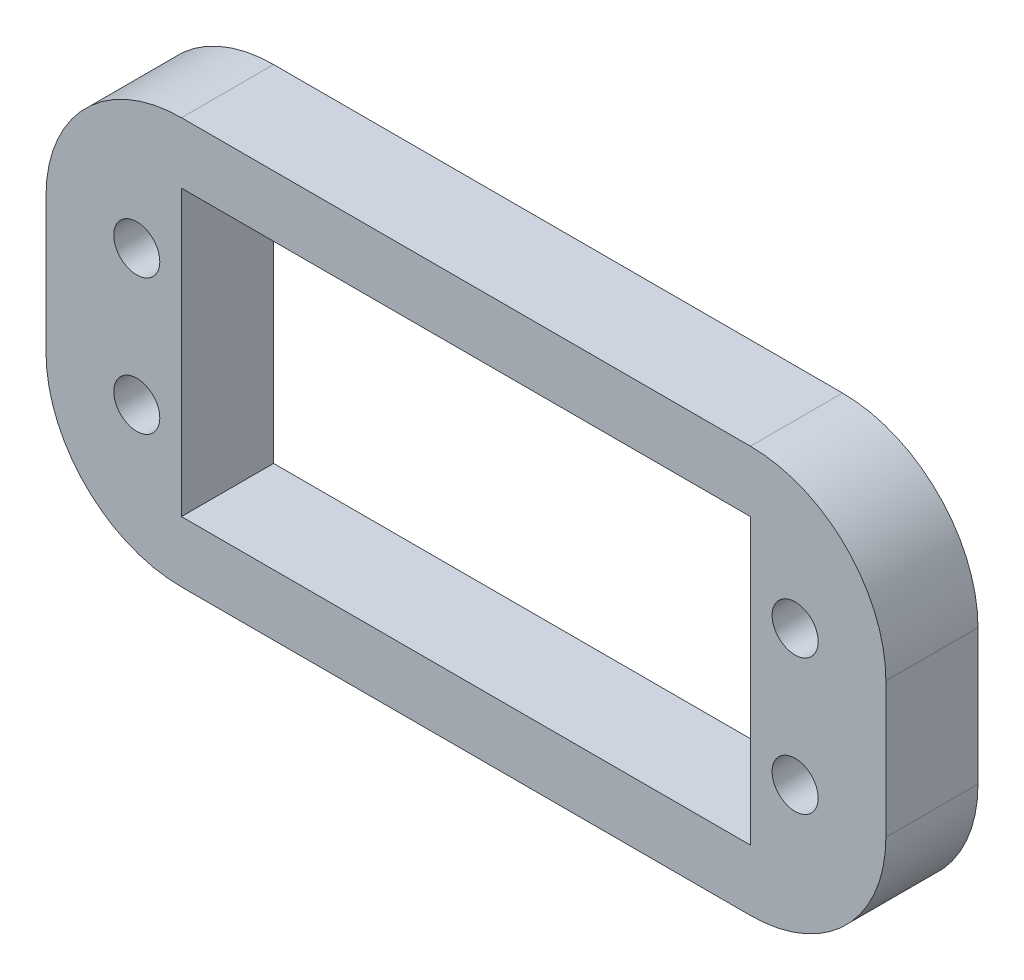
ISO-10303-21;
HEADER;
FILE_DESCRIPTION(('STEP AP214'),'2;1');
FILE_NAME('part.step','',(''),(''),'','','');
FILE_SCHEMA(('AUTOMOTIVE_DESIGN { 1 0 10303 214 1 1 1 1 }'));
ENDSEC;
DATA;
#1=APPLICATION_CONTEXT('core data for automotive mechanical design processes');
#2=APPLICATION_PROTOCOL_DEFINITION('international standard','automotive_design',2000,#1);
#3=PRODUCT_CONTEXT('',#1,'mechanical');
#4=PRODUCT('Part','Part','',(#3));
#5=PRODUCT_RELATED_PRODUCT_CATEGORY('part','',(#4));
#6=PRODUCT_DEFINITION_FORMATION('','',#4);
#7=PRODUCT_DEFINITION_CONTEXT('part definition',#1,'design');
#8=PRODUCT_DEFINITION('design','',#6,#7);
#9=PRODUCT_DEFINITION_SHAPE('','',#8);
#10=(LENGTH_UNIT() NAMED_UNIT(*) SI_UNIT(.MILLI.,.METRE.));
#11=(NAMED_UNIT(*) PLANE_ANGLE_UNIT() SI_UNIT($,.RADIAN.));
#12=(NAMED_UNIT(*) SI_UNIT($,.STERADIAN.) SOLID_ANGLE_UNIT());
#13=UNCERTAINTY_MEASURE_WITH_UNIT(LENGTH_MEASURE(1.E-05),#10,'distance_accuracy_value','');
#14=(GEOMETRIC_REPRESENTATION_CONTEXT(3) GLOBAL_UNCERTAINTY_ASSIGNED_CONTEXT((#13)) GLOBAL_UNIT_ASSIGNED_CONTEXT((#10,
#11,#12)) REPRESENTATION_CONTEXT('',''));
#15=CARTESIAN_POINT('',(0.,0.,0.));
#16=DIRECTION('',(0.,0.,1.));
#17=DIRECTION('',(1.,0.,0.));
#18=AXIS2_PLACEMENT_3D('',#15,#16,#17);
#19=CARTESIAN_POINT('',(0.,0.,6.8));
#20=DIRECTION('',(0.,0.,-1.));
#21=DIRECTION('',(-1.,0.,0.));
#22=AXIS2_PLACEMENT_3D('',#19,#20,#21);
#23=PLANE('',#22);
#24=DIRECTION('',(-1.,0.,0.));
#25=VECTOR('',#24,1.);
#26=CARTESIAN_POINT('',(0.,30.,6.8));
#27=LINE('',#26,#25);
#28=CARTESIAN_POINT('',(52.,30.,6.8));
#29=VERTEX_POINT('',#28);
#30=CARTESIAN_POINT('',(10.,30.,6.8));
#31=VERTEX_POINT('',#30);
#32=EDGE_CURVE('E182',#29,#31,#27,.T.);
#33=ORIENTED_EDGE('',*,*,#32,.T.);
#34=CARTESIAN_POINT('',(10.,20.,6.8));
#35=DIRECTION('',(0.,0.,-1.));
#36=DIRECTION('',(-1.,0.,0.));
#37=AXIS2_PLACEMENT_3D('',#34,#35,#36);
#38=CIRCLE('',#37,10.);
#39=CARTESIAN_POINT('',(0.,20.,6.8));
#40=VERTEX_POINT('',#39);
#41=EDGE_CURVE('E217',#31,#40,#38,.F.);
#42=ORIENTED_EDGE('',*,*,#41,.T.);
#43=DIRECTION('',(0.,-1.,0.));
#44=VECTOR('',#43,1.);
#45=CARTESIAN_POINT('',(0.,0.,6.8));
#46=LINE('',#45,#44);
#47=CARTESIAN_POINT('',(0.,10.,6.8));
#48=VERTEX_POINT('',#47);
#49=EDGE_CURVE('E174',#40,#48,#46,.T.);
#50=ORIENTED_EDGE('',*,*,#49,.T.);
#51=CARTESIAN_POINT('',(10.,10.,6.8));
#52=DIRECTION('',(0.,0.,-1.));
#53=DIRECTION('',(-1.,0.,0.));
#54=AXIS2_PLACEMENT_3D('',#51,#52,#53);
#55=CIRCLE('',#54,10.);
#56=CARTESIAN_POINT('',(10.,0.,6.8));
#57=VERTEX_POINT('',#56);
#58=EDGE_CURVE('E212',#48,#57,#55,.F.);
#59=ORIENTED_EDGE('',*,*,#58,.T.);
#60=DIRECTION('',(1.,0.,0.));
#61=VECTOR('',#60,1.);
#62=CARTESIAN_POINT('',(0.,0.,6.8));
#63=LINE('',#62,#61);
#64=CARTESIAN_POINT('',(52.,0.,6.8));
#65=VERTEX_POINT('',#64);
#66=EDGE_CURVE('E177',#57,#65,#63,.T.);
#67=ORIENTED_EDGE('',*,*,#66,.T.);
#68=CARTESIAN_POINT('',(52.,10.,6.8));
#69=DIRECTION('',(0.,0.,-1.));
#70=DIRECTION('',(-1.,0.,0.));
#71=AXIS2_PLACEMENT_3D('',#68,#69,#70);
#72=CIRCLE('',#71,10.);
#73=CARTESIAN_POINT('',(62.,10.,6.8));
#74=VERTEX_POINT('',#73);
#75=EDGE_CURVE('E61',#65,#74,#72,.F.);
#76=ORIENTED_EDGE('',*,*,#75,.T.);
#77=DIRECTION('',(0.,1.,0.));
#78=VECTOR('',#77,1.);
#79=CARTESIAN_POINT('',(62.,0.,6.8));
#80=LINE('',#79,#78);
#81=CARTESIAN_POINT('',(62.,20.,6.8));
#82=VERTEX_POINT('',#81);
#83=EDGE_CURVE('E180',#74,#82,#80,.T.);
#84=ORIENTED_EDGE('',*,*,#83,.T.);
#85=CARTESIAN_POINT('',(52.,20.,6.8));
#86=DIRECTION('',(0.,0.,-1.));
#87=DIRECTION('',(-1.,0.,0.));
#88=AXIS2_PLACEMENT_3D('',#85,#86,#87);
#89=CIRCLE('',#88,10.);
#90=EDGE_CURVE('E215',#82,#29,#89,.F.);
#91=ORIENTED_EDGE('',*,*,#90,.T.);
#92=EDGE_LOOP('',(#33,#42,#50,#59,#67,#76,#84,#91));
#93=FACE_BOUND('',#92,.T.);
#94=DIRECTION('',(0.,-1.,0.));
#95=VECTOR('',#94,1.);
#96=CARTESIAN_POINT('',(9.99999999999999,25.5,6.8));
#97=LINE('',#96,#95);
#98=CARTESIAN_POINT('',(9.99999999999999,25.5,6.8));
#99=VERTEX_POINT('',#98);
#100=CARTESIAN_POINT('',(10.,4.49999999999998,6.8));
#101=VERTEX_POINT('',#100);
#102=EDGE_CURVE('E130',#99,#101,#97,.T.);
#103=ORIENTED_EDGE('',*,*,#102,.F.);
#104=DIRECTION('',(-1.,0.,0.));
#105=VECTOR('',#104,1.);
#106=CARTESIAN_POINT('',(9.99999999999999,25.5,6.8));
#107=LINE('',#106,#105);
#108=CARTESIAN_POINT('',(52.,25.5,6.8));
#109=VERTEX_POINT('',#108);
#110=EDGE_CURVE('E156',#109,#99,#107,.T.);
#111=ORIENTED_EDGE('',*,*,#110,.F.);
#112=DIRECTION('',(0.,1.,0.));
#113=VECTOR('',#112,1.);
#114=CARTESIAN_POINT('',(52.,25.5,6.8));
#115=LINE('',#114,#113);
#116=CARTESIAN_POINT('',(52.,4.5,6.8));
#117=VERTEX_POINT('',#116);
#118=EDGE_CURVE('E154',#117,#109,#115,.T.);
#119=ORIENTED_EDGE('',*,*,#118,.F.);
#120=DIRECTION('',(1.,0.,0.));
#121=VECTOR('',#120,1.);
#122=CARTESIAN_POINT('',(10.,4.49999999999998,6.8));
#123=LINE('',#122,#121);
#124=EDGE_CURVE('E140',#101,#117,#123,.T.);
#125=ORIENTED_EDGE('',*,*,#124,.F.);
#126=EDGE_LOOP('',(#103,#111,#119,#125));
#127=FACE_BOUND('',#126,.T.);
#128=CARTESIAN_POINT('',(6.7,20.,6.8));
#129=DIRECTION('',(0.,0.,1.));
#130=DIRECTION('',(1.,0.,0.));
#131=AXIS2_PLACEMENT_3D('',#128,#129,#130);
#132=CIRCLE('',#131,1.7);
#133=CARTESIAN_POINT('',(8.4,20.,6.8));
#134=VERTEX_POINT('',#133);
#135=EDGE_CURVE('E163',#134,#134,#132,.T.);
#136=ORIENTED_EDGE('',*,*,#135,.F.);
#137=EDGE_LOOP('',(#136));
#138=FACE_BOUND('',#137,.T.);
#139=CARTESIAN_POINT('',(6.7,10.,6.8));
#140=DIRECTION('',(0.,0.,1.));
#141=DIRECTION('',(1.,0.,0.));
#142=AXIS2_PLACEMENT_3D('',#139,#140,#141);
#143=CIRCLE('',#142,1.7);
#144=CARTESIAN_POINT('',(8.4,10.,6.8));
#145=VERTEX_POINT('',#144);
#146=EDGE_CURVE('E434',#145,#145,#143,.T.);
#147=ORIENTED_EDGE('',*,*,#146,.F.);
#148=EDGE_LOOP('',(#147));
#149=FACE_BOUND('',#148,.T.);
#150=CARTESIAN_POINT('',(55.3,10.,6.8));
#151=DIRECTION('',(0.,0.,1.));
#152=DIRECTION('',(-1.,0.,0.));
#153=AXIS2_PLACEMENT_3D('',#150,#151,#152);
#154=CIRCLE('',#153,1.7);
#155=CARTESIAN_POINT('',(53.6,10.,6.8));
#156=VERTEX_POINT('',#155);
#157=EDGE_CURVE('E429',#156,#156,#154,.T.);
#158=ORIENTED_EDGE('',*,*,#157,.F.);
#159=EDGE_LOOP('',(#158));
#160=FACE_BOUND('',#159,.T.);
#161=CARTESIAN_POINT('',(55.3,20.,6.8));
#162=DIRECTION('',(0.,0.,1.));
#163=DIRECTION('',(-1.,0.,0.));
#164=AXIS2_PLACEMENT_3D('',#161,#162,#163);
#165=CIRCLE('',#164,1.7);
#166=CARTESIAN_POINT('',(53.6,20.,6.8));
#167=VERTEX_POINT('',#166);
#168=EDGE_CURVE('E423',#167,#167,#165,.T.);
#169=ORIENTED_EDGE('',*,*,#168,.F.);
#170=EDGE_LOOP('',(#169));
#171=FACE_BOUND('',#170,.T.);
#172=ADVANCED_FACE('F39',(#93,#127,#138,#149,#160,#171),#23,.F.);
#173=CARTESIAN_POINT('',(0.,0.,0.));
#174=DIRECTION('',(0.,0.,-1.));
#175=DIRECTION('',(-1.,0.,0.));
#176=AXIS2_PLACEMENT_3D('',#173,#174,#175);
#177=PLANE('',#176);
#178=CARTESIAN_POINT('',(55.3,10.,0.));
#179=DIRECTION('',(0.,0.,1.));
#180=DIRECTION('',(-1.,0.,0.));
#181=AXIS2_PLACEMENT_3D('',#178,#179,#180);
#182=CIRCLE('',#181,1.7);
#183=CARTESIAN_POINT('',(53.6,10.,0.));
#184=VERTEX_POINT('',#183);
#185=EDGE_CURVE('E426',#184,#184,#182,.T.);
#186=ORIENTED_EDGE('',*,*,#185,.T.);
#187=EDGE_LOOP('',(#186));
#188=FACE_BOUND('',#187,.T.);
#189=CARTESIAN_POINT('',(6.7,20.,0.));
#190=DIRECTION('',(0.,0.,1.));
#191=DIRECTION('',(1.,0.,0.));
#192=AXIS2_PLACEMENT_3D('',#189,#190,#191);
#193=CIRCLE('',#192,1.7);
#194=CARTESIAN_POINT('',(8.4,20.,0.));
#195=VERTEX_POINT('',#194);
#196=EDGE_CURVE('E437',#195,#195,#193,.T.);
#197=ORIENTED_EDGE('',*,*,#196,.T.);
#198=EDGE_LOOP('',(#197));
#199=FACE_BOUND('',#198,.T.);
#200=DIRECTION('',(0.,-1.,0.));
#201=VECTOR('',#200,1.);
#202=CARTESIAN_POINT('',(0.,0.,0.));
#203=LINE('',#202,#201);
#204=CARTESIAN_POINT('',(0.,20.,0.));
#205=VERTEX_POINT('',#204);
#206=CARTESIAN_POINT('',(0.,10.,0.));
#207=VERTEX_POINT('',#206);
#208=EDGE_CURVE('E148',#205,#207,#203,.T.);
#209=ORIENTED_EDGE('',*,*,#208,.F.);
#210=CARTESIAN_POINT('',(10.,20.,0.));
#211=DIRECTION('',(0.,0.,-1.));
#212=DIRECTION('',(-1.,0.,0.));
#213=AXIS2_PLACEMENT_3D('',#210,#211,#212);
#214=CIRCLE('',#213,10.);
#215=CARTESIAN_POINT('',(10.,30.,0.));
#216=VERTEX_POINT('',#215);
#217=EDGE_CURVE('E205',#205,#216,#214,.T.);
#218=ORIENTED_EDGE('',*,*,#217,.T.);
#219=DIRECTION('',(-1.,0.,0.));
#220=VECTOR('',#219,1.);
#221=CARTESIAN_POINT('',(0.,30.,0.));
#222=LINE('',#221,#220);
#223=CARTESIAN_POINT('',(52.,30.,0.));
#224=VERTEX_POINT('',#223);
#225=EDGE_CURVE('E178',#224,#216,#222,.T.);
#226=ORIENTED_EDGE('',*,*,#225,.F.);
#227=CARTESIAN_POINT('',(52.,20.,0.));
#228=DIRECTION('',(0.,0.,-1.));
#229=DIRECTION('',(-1.,0.,0.));
#230=AXIS2_PLACEMENT_3D('',#227,#228,#229);
#231=CIRCLE('',#230,10.);
#232=CARTESIAN_POINT('',(62.,20.,0.));
#233=VERTEX_POINT('',#232);
#234=EDGE_CURVE('E203',#224,#233,#231,.T.);
#235=ORIENTED_EDGE('',*,*,#234,.T.);
#236=DIRECTION('',(0.,1.,0.));
#237=VECTOR('',#236,1.);
#238=CARTESIAN_POINT('',(62.,0.,0.));
#239=LINE('',#238,#237);
#240=CARTESIAN_POINT('',(62.,10.,0.));
#241=VERTEX_POINT('',#240);
#242=EDGE_CURVE('E191',#241,#233,#239,.T.);
#243=ORIENTED_EDGE('',*,*,#242,.F.);
#244=CARTESIAN_POINT('',(52.,10.,0.));
#245=DIRECTION('',(0.,0.,-1.));
#246=DIRECTION('',(-1.,0.,0.));
#247=AXIS2_PLACEMENT_3D('',#244,#245,#246);
#248=CIRCLE('',#247,10.);
#249=CARTESIAN_POINT('',(52.,0.,0.));
#250=VERTEX_POINT('',#249);
#251=EDGE_CURVE('E201',#241,#250,#248,.T.);
#252=ORIENTED_EDGE('',*,*,#251,.T.);
#253=DIRECTION('',(1.,0.,0.));
#254=VECTOR('',#253,1.);
#255=CARTESIAN_POINT('',(0.,0.,0.));
#256=LINE('',#255,#254);
#257=CARTESIAN_POINT('',(10.,0.,0.));
#258=VERTEX_POINT('',#257);
#259=EDGE_CURVE('E188',#258,#250,#256,.T.);
#260=ORIENTED_EDGE('',*,*,#259,.F.);
#261=CARTESIAN_POINT('',(10.,10.,0.));
#262=DIRECTION('',(0.,0.,-1.));
#263=DIRECTION('',(-1.,0.,0.));
#264=AXIS2_PLACEMENT_3D('',#261,#262,#263);
#265=CIRCLE('',#264,10.);
#266=EDGE_CURVE('E199',#258,#207,#265,.T.);
#267=ORIENTED_EDGE('',*,*,#266,.T.);
#268=EDGE_LOOP('',(#209,#218,#226,#235,#243,#252,#260,#267));
#269=FACE_BOUND('',#268,.T.);
#270=DIRECTION('',(-1.,0.,0.));
#271=VECTOR('',#270,1.);
#272=CARTESIAN_POINT('',(9.99999999999999,25.5,0.));
#273=LINE('',#272,#271);
#274=CARTESIAN_POINT('',(52.,25.5,0.));
#275=VERTEX_POINT('',#274);
#276=CARTESIAN_POINT('',(9.99999999999999,25.5,0.));
#277=VERTEX_POINT('',#276);
#278=EDGE_CURVE('E141',#275,#277,#273,.T.);
#279=ORIENTED_EDGE('',*,*,#278,.T.);
#280=DIRECTION('',(0.,-1.,0.));
#281=VECTOR('',#280,1.);
#282=CARTESIAN_POINT('',(9.99999999999999,25.5,0.));
#283=LINE('',#282,#281);
#284=CARTESIAN_POINT('',(10.,4.49999999999998,0.));
#285=VERTEX_POINT('',#284);
#286=EDGE_CURVE('E161',#277,#285,#283,.T.);
#287=ORIENTED_EDGE('',*,*,#286,.T.);
#288=DIRECTION('',(1.,0.,0.));
#289=VECTOR('',#288,1.);
#290=CARTESIAN_POINT('',(10.,4.49999999999998,0.));
#291=LINE('',#290,#289);
#292=CARTESIAN_POINT('',(52.,4.5,0.));
#293=VERTEX_POINT('',#292);
#294=EDGE_CURVE('E147',#285,#293,#291,.T.);
#295=ORIENTED_EDGE('',*,*,#294,.T.);
#296=DIRECTION('',(0.,1.,0.));
#297=VECTOR('',#296,1.);
#298=CARTESIAN_POINT('',(52.,25.5,0.));
#299=LINE('',#298,#297);
#300=EDGE_CURVE('E165',#293,#275,#299,.T.);
#301=ORIENTED_EDGE('',*,*,#300,.T.);
#302=EDGE_LOOP('',(#279,#287,#295,#301));
#303=FACE_BOUND('',#302,.T.);
#304=CARTESIAN_POINT('',(6.7,10.,0.));
#305=DIRECTION('',(0.,0.,1.));
#306=DIRECTION('',(1.,0.,0.));
#307=AXIS2_PLACEMENT_3D('',#304,#305,#306);
#308=CIRCLE('',#307,1.7);
#309=CARTESIAN_POINT('',(8.4,10.,0.));
#310=VERTEX_POINT('',#309);
#311=EDGE_CURVE('E418',#310,#310,#308,.T.);
#312=ORIENTED_EDGE('',*,*,#311,.T.);
#313=EDGE_LOOP('',(#312));
#314=FACE_BOUND('',#313,.T.);
#315=CARTESIAN_POINT('',(55.3,20.,0.));
#316=DIRECTION('',(0.,0.,1.));
#317=DIRECTION('',(-1.,0.,0.));
#318=AXIS2_PLACEMENT_3D('',#315,#316,#317);
#319=CIRCLE('',#318,1.7);
#320=CARTESIAN_POINT('',(53.6,20.,0.));
#321=VERTEX_POINT('',#320);
#322=EDGE_CURVE('E421',#321,#321,#319,.T.);
#323=ORIENTED_EDGE('',*,*,#322,.T.);
#324=EDGE_LOOP('',(#323));
#325=FACE_BOUND('',#324,.T.);
#326=ADVANCED_FACE('F233',(#188,#199,#269,#303,#314,#325),#177,.T.);
#327=CARTESIAN_POINT('',(0.,0.,6.8));
#328=DIRECTION('',(1.,0.,0.));
#329=DIRECTION('',(0.,0.,-1.));
#330=AXIS2_PLACEMENT_3D('',#327,#328,#329);
#331=PLANE('',#330);
#332=ORIENTED_EDGE('',*,*,#49,.F.);
#333=DIRECTION('',(0.,0.,-1.));
#334=VECTOR('',#333,1.);
#335=CARTESIAN_POINT('',(0.,20.,6.8));
#336=LINE('',#335,#334);
#337=EDGE_CURVE('E196',#40,#205,#336,.T.);
#338=ORIENTED_EDGE('',*,*,#337,.T.);
#339=ORIENTED_EDGE('',*,*,#208,.T.);
#340=DIRECTION('',(0.,0.,-1.));
#341=VECTOR('',#340,1.);
#342=CARTESIAN_POINT('',(0.,10.,6.8));
#343=LINE('',#342,#341);
#344=EDGE_CURVE('E185',#207,#48,#343,.F.);
#345=ORIENTED_EDGE('',*,*,#344,.T.);
#346=EDGE_LOOP('',(#332,#338,#339,#345));
#347=FACE_BOUND('',#346,.T.);
#348=ADVANCED_FACE('F255',(#347),#331,.F.);
#349=CARTESIAN_POINT('',(0.,0.,6.8));
#350=DIRECTION('',(0.,1.,0.));
#351=DIRECTION('',(-1.,0.,0.));
#352=AXIS2_PLACEMENT_3D('',#349,#350,#351);
#353=PLANE('',#352);
#354=ORIENTED_EDGE('',*,*,#259,.T.);
#355=DIRECTION('',(0.,0.,-1.));
#356=VECTOR('',#355,1.);
#357=CARTESIAN_POINT('',(52.,0.,6.8));
#358=LINE('',#357,#356);
#359=EDGE_CURVE('E11',#250,#65,#358,.F.);
#360=ORIENTED_EDGE('',*,*,#359,.T.);
#361=ORIENTED_EDGE('',*,*,#66,.F.);
#362=DIRECTION('',(0.,0.,-1.));
#363=VECTOR('',#362,1.);
#364=CARTESIAN_POINT('',(10.,0.,6.8));
#365=LINE('',#364,#363);
#366=EDGE_CURVE('E47',#57,#258,#365,.T.);
#367=ORIENTED_EDGE('',*,*,#366,.T.);
#368=EDGE_LOOP('',(#354,#360,#361,#367));
#369=FACE_BOUND('',#368,.T.);
#370=ADVANCED_FACE('F227',(#369),#353,.F.);
#371=CARTESIAN_POINT('',(62.,0.,6.8));
#372=DIRECTION('',(-1.,0.,0.));
#373=DIRECTION('',(0.,0.,1.));
#374=AXIS2_PLACEMENT_3D('',#371,#372,#373);
#375=PLANE('',#374);
#376=ORIENTED_EDGE('',*,*,#242,.T.);
#377=DIRECTION('',(0.,0.,-1.));
#378=VECTOR('',#377,1.);
#379=CARTESIAN_POINT('',(62.,20.,6.8));
#380=LINE('',#379,#378);
#381=EDGE_CURVE('E54',#233,#82,#380,.F.);
#382=ORIENTED_EDGE('',*,*,#381,.T.);
#383=ORIENTED_EDGE('',*,*,#83,.F.);
#384=DIRECTION('',(0.,0.,-1.));
#385=VECTOR('',#384,1.);
#386=CARTESIAN_POINT('',(62.,10.,6.8));
#387=LINE('',#386,#385);
#388=EDGE_CURVE('E219',#74,#241,#387,.T.);
#389=ORIENTED_EDGE('',*,*,#388,.T.);
#390=EDGE_LOOP('',(#376,#382,#383,#389));
#391=FACE_BOUND('',#390,.T.);
#392=ADVANCED_FACE('F239',(#391),#375,.F.);
#393=CARTESIAN_POINT('',(0.,30.,6.8));
#394=DIRECTION('',(0.,-1.,0.));
#395=DIRECTION('',(1.,0.,0.));
#396=AXIS2_PLACEMENT_3D('',#393,#394,#395);
#397=PLANE('',#396);
#398=ORIENTED_EDGE('',*,*,#225,.T.);
#399=DIRECTION('',(0.,0.,-1.));
#400=VECTOR('',#399,1.);
#401=CARTESIAN_POINT('',(10.,30.,6.8));
#402=LINE('',#401,#400);
#403=EDGE_CURVE('E210',#216,#31,#402,.F.);
#404=ORIENTED_EDGE('',*,*,#403,.T.);
#405=ORIENTED_EDGE('',*,*,#32,.F.);
#406=DIRECTION('',(0.,0.,-1.));
#407=VECTOR('',#406,1.);
#408=CARTESIAN_POINT('',(52.,30.,6.8));
#409=LINE('',#408,#407);
#410=EDGE_CURVE('E207',#29,#224,#409,.T.);
#411=ORIENTED_EDGE('',*,*,#410,.T.);
#412=EDGE_LOOP('',(#398,#404,#405,#411));
#413=FACE_BOUND('',#412,.T.);
#414=ADVANCED_FACE('F247',(#413),#397,.F.);
#415=CARTESIAN_POINT('',(9.99999999999999,25.5,6.8));
#416=DIRECTION('',(1.,0.,0.));
#417=DIRECTION('',(0.,1.,0.));
#418=AXIS2_PLACEMENT_3D('',#415,#416,#417);
#419=PLANE('',#418);
#420=ORIENTED_EDGE('',*,*,#286,.F.);
#421=DIRECTION('',(0.,0.,-1.));
#422=VECTOR('',#421,1.);
#423=CARTESIAN_POINT('',(9.99999999999999,25.5,6.8));
#424=LINE('',#423,#422);
#425=EDGE_CURVE('E136',#99,#277,#424,.T.);
#426=ORIENTED_EDGE('',*,*,#425,.F.);
#427=ORIENTED_EDGE('',*,*,#102,.T.);
#428=DIRECTION('',(0.,0.,-1.));
#429=VECTOR('',#428,1.);
#430=CARTESIAN_POINT('',(10.,4.49999999999998,6.8));
#431=LINE('',#430,#429);
#432=EDGE_CURVE('E133',#101,#285,#431,.T.);
#433=ORIENTED_EDGE('',*,*,#432,.T.);
#434=EDGE_LOOP('',(#420,#426,#427,#433));
#435=FACE_BOUND('',#434,.T.);
#436=ADVANCED_FACE('F132',(#435),#419,.T.);
#437=CARTESIAN_POINT('',(10.,4.49999999999998,6.8));
#438=DIRECTION('',(0.,1.,0.));
#439=DIRECTION('',(-1.,0.,0.));
#440=AXIS2_PLACEMENT_3D('',#437,#438,#439);
#441=PLANE('',#440);
#442=ORIENTED_EDGE('',*,*,#294,.F.);
#443=ORIENTED_EDGE('',*,*,#432,.F.);
#444=ORIENTED_EDGE('',*,*,#124,.T.);
#445=DIRECTION('',(0.,0.,-1.));
#446=VECTOR('',#445,1.);
#447=CARTESIAN_POINT('',(52.,4.5,6.8));
#448=LINE('',#447,#446);
#449=EDGE_CURVE('E149',#117,#293,#448,.T.);
#450=ORIENTED_EDGE('',*,*,#449,.T.);
#451=EDGE_LOOP('',(#442,#443,#444,#450));
#452=FACE_BOUND('',#451,.T.);
#453=ADVANCED_FACE('F144',(#452),#441,.T.);
#454=CARTESIAN_POINT('',(52.,25.5,6.8));
#455=DIRECTION('',(-1.,0.,0.));
#456=DIRECTION('',(0.,0.,1.));
#457=AXIS2_PLACEMENT_3D('',#454,#455,#456);
#458=PLANE('',#457);
#459=ORIENTED_EDGE('',*,*,#300,.F.);
#460=ORIENTED_EDGE('',*,*,#449,.F.);
#461=ORIENTED_EDGE('',*,*,#118,.T.);
#462=DIRECTION('',(0.,0.,-1.));
#463=VECTOR('',#462,1.);
#464=CARTESIAN_POINT('',(52.,25.5,6.8));
#465=LINE('',#464,#463);
#466=EDGE_CURVE('E171',#109,#275,#465,.T.);
#467=ORIENTED_EDGE('',*,*,#466,.T.);
#468=EDGE_LOOP('',(#459,#460,#461,#467));
#469=FACE_BOUND('',#468,.T.);
#470=ADVANCED_FACE('F346',(#469),#458,.T.);
#471=CARTESIAN_POINT('',(9.99999999999999,25.5,6.8));
#472=DIRECTION('',(0.,-1.,0.));
#473=DIRECTION('',(1.,0.,0.));
#474=AXIS2_PLACEMENT_3D('',#471,#472,#473);
#475=PLANE('',#474);
#476=ORIENTED_EDGE('',*,*,#278,.F.);
#477=ORIENTED_EDGE('',*,*,#466,.F.);
#478=ORIENTED_EDGE('',*,*,#110,.T.);
#479=ORIENTED_EDGE('',*,*,#425,.T.);
#480=EDGE_LOOP('',(#476,#477,#478,#479));
#481=FACE_BOUND('',#480,.T.);
#482=ADVANCED_FACE('F337',(#481),#475,.T.);
#483=CARTESIAN_POINT('',(6.7,20.,6.8));
#484=DIRECTION('',(0.,0.,-1.));
#485=DIRECTION('',(-1.,0.,0.));
#486=AXIS2_PLACEMENT_3D('',#483,#484,#485);
#487=CYLINDRICAL_SURFACE('',#486,1.7);
#488=ORIENTED_EDGE('',*,*,#135,.T.);
#489=EDGE_LOOP('',(#488));
#490=FACE_BOUND('',#489,.T.);
#491=ORIENTED_EDGE('',*,*,#196,.F.);
#492=EDGE_LOOP('',(#491));
#493=FACE_BOUND('',#492,.T.);
#494=ADVANCED_FACE('F328',(#490,#493),#487,.F.);
#495=CARTESIAN_POINT('',(6.7,10.,6.8));
#496=DIRECTION('',(0.,0.,-1.));
#497=DIRECTION('',(-1.,0.,0.));
#498=AXIS2_PLACEMENT_3D('',#495,#496,#497);
#499=CYLINDRICAL_SURFACE('',#498,1.7);
#500=ORIENTED_EDGE('',*,*,#146,.T.);
#501=EDGE_LOOP('',(#500));
#502=FACE_BOUND('',#501,.T.);
#503=ORIENTED_EDGE('',*,*,#311,.F.);
#504=EDGE_LOOP('',(#503));
#505=FACE_BOUND('',#504,.T.);
#506=ADVANCED_FACE('F319',(#502,#505),#499,.F.);
#507=CARTESIAN_POINT('',(55.3,10.,6.8));
#508=DIRECTION('',(0.,0.,-1.));
#509=DIRECTION('',(-1.,0.,0.));
#510=AXIS2_PLACEMENT_3D('',#507,#508,#509);
#511=CYLINDRICAL_SURFACE('',#510,1.7);
#512=ORIENTED_EDGE('',*,*,#157,.T.);
#513=EDGE_LOOP('',(#512));
#514=FACE_BOUND('',#513,.T.);
#515=ORIENTED_EDGE('',*,*,#185,.F.);
#516=EDGE_LOOP('',(#515));
#517=FACE_BOUND('',#516,.T.);
#518=ADVANCED_FACE('F310',(#514,#517),#511,.F.);
#519=CARTESIAN_POINT('',(55.3,20.,6.8));
#520=DIRECTION('',(0.,0.,-1.));
#521=DIRECTION('',(-1.,0.,0.));
#522=AXIS2_PLACEMENT_3D('',#519,#520,#521);
#523=CYLINDRICAL_SURFACE('',#522,1.7);
#524=ORIENTED_EDGE('',*,*,#168,.T.);
#525=EDGE_LOOP('',(#524));
#526=FACE_BOUND('',#525,.T.);
#527=ORIENTED_EDGE('',*,*,#322,.F.);
#528=EDGE_LOOP('',(#527));
#529=FACE_BOUND('',#528,.T.);
#530=ADVANCED_FACE('F282',(#526,#529),#523,.F.);
#531=CARTESIAN_POINT('',(10.,20.,6.8));
#532=DIRECTION('',(0.,0.,-1.));
#533=DIRECTION('',(-1.,0.,0.));
#534=AXIS2_PLACEMENT_3D('',#531,#532,#533);
#535=CYLINDRICAL_SURFACE('',#534,10.);
#536=ORIENTED_EDGE('',*,*,#41,.F.);
#537=ORIENTED_EDGE('',*,*,#403,.F.);
#538=ORIENTED_EDGE('',*,*,#217,.F.);
#539=ORIENTED_EDGE('',*,*,#337,.F.);
#540=EDGE_LOOP('',(#536,#537,#538,#539));
#541=FACE_BOUND('',#540,.T.);
#542=ADVANCED_FACE('F252',(#541),#535,.T.);
#543=CARTESIAN_POINT('',(52.,20.,6.8));
#544=DIRECTION('',(0.,0.,-1.));
#545=DIRECTION('',(-1.,0.,0.));
#546=AXIS2_PLACEMENT_3D('',#543,#544,#545);
#547=CYLINDRICAL_SURFACE('',#546,10.);
#548=ORIENTED_EDGE('',*,*,#90,.F.);
#549=ORIENTED_EDGE('',*,*,#381,.F.);
#550=ORIENTED_EDGE('',*,*,#234,.F.);
#551=ORIENTED_EDGE('',*,*,#410,.F.);
#552=EDGE_LOOP('',(#548,#549,#550,#551));
#553=FACE_BOUND('',#552,.T.);
#554=ADVANCED_FACE('F244',(#553),#547,.T.);
#555=CARTESIAN_POINT('',(52.,10.,6.8));
#556=DIRECTION('',(0.,0.,-1.));
#557=DIRECTION('',(-1.,0.,0.));
#558=AXIS2_PLACEMENT_3D('',#555,#556,#557);
#559=CYLINDRICAL_SURFACE('',#558,10.);
#560=ORIENTED_EDGE('',*,*,#75,.F.);
#561=ORIENTED_EDGE('',*,*,#359,.F.);
#562=ORIENTED_EDGE('',*,*,#251,.F.);
#563=ORIENTED_EDGE('',*,*,#388,.F.);
#564=EDGE_LOOP('',(#560,#561,#562,#563));
#565=FACE_BOUND('',#564,.T.);
#566=ADVANCED_FACE('F238',(#565),#559,.T.);
#567=CARTESIAN_POINT('',(10.,10.,6.8));
#568=DIRECTION('',(0.,0.,-1.));
#569=DIRECTION('',(-1.,0.,0.));
#570=AXIS2_PLACEMENT_3D('',#567,#568,#569);
#571=CYLINDRICAL_SURFACE('',#570,10.);
#572=ORIENTED_EDGE('',*,*,#58,.F.);
#573=ORIENTED_EDGE('',*,*,#344,.F.);
#574=ORIENTED_EDGE('',*,*,#266,.F.);
#575=ORIENTED_EDGE('',*,*,#366,.F.);
#576=EDGE_LOOP('',(#572,#573,#574,#575));
#577=FACE_BOUND('',#576,.T.);
#578=ADVANCED_FACE('F41',(#577),#571,.T.);
#579=CLOSED_SHELL('',(#172,#326,#348,#370,#392,#414,#436,#453,#470,#482,#494,#506,#518,#530,
#542,#554,#566,#578));
#580=MANIFOLD_SOLID_BREP('B2',#579);
#581=ADVANCED_BREP_SHAPE_REPRESENTATION('',(#18,#580),#14);
#582=SHAPE_DEFINITION_REPRESENTATION(#9,#581);
ENDSEC;
END-ISO-10303-21;
